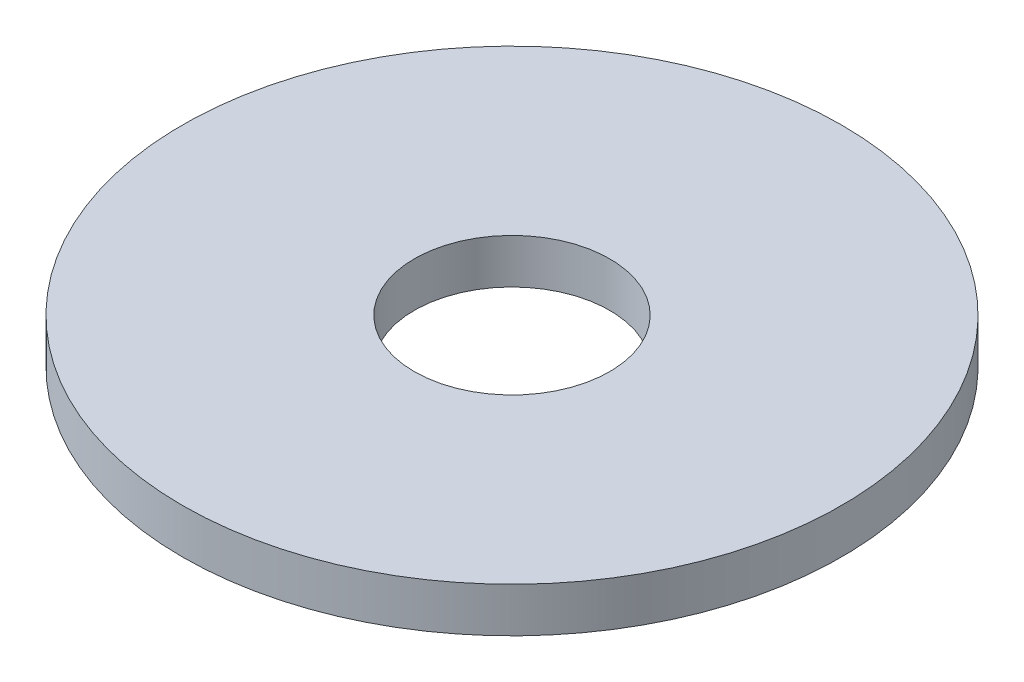
ISO-10303-21;
HEADER;
FILE_DESCRIPTION(('STEP AP214'),'2;1');
FILE_NAME('part.step','',(''),(''),'','','');
FILE_SCHEMA(('AUTOMOTIVE_DESIGN { 1 0 10303 214 1 1 1 1 }'));
ENDSEC;
DATA;
#1=APPLICATION_CONTEXT('core data for automotive mechanical design processes');
#2=APPLICATION_PROTOCOL_DEFINITION('international standard','automotive_design',2000,#1);
#3=PRODUCT_CONTEXT('',#1,'mechanical');
#4=PRODUCT('Part','Part','',(#3));
#5=PRODUCT_RELATED_PRODUCT_CATEGORY('part','',(#4));
#6=PRODUCT_DEFINITION_FORMATION('','',#4);
#7=PRODUCT_DEFINITION_CONTEXT('part definition',#1,'design');
#8=PRODUCT_DEFINITION('design','',#6,#7);
#9=PRODUCT_DEFINITION_SHAPE('','',#8);
#10=(LENGTH_UNIT() NAMED_UNIT(*) SI_UNIT(.MILLI.,.METRE.));
#11=(NAMED_UNIT(*) PLANE_ANGLE_UNIT() SI_UNIT($,.RADIAN.));
#12=(NAMED_UNIT(*) SI_UNIT($,.STERADIAN.) SOLID_ANGLE_UNIT());
#13=UNCERTAINTY_MEASURE_WITH_UNIT(LENGTH_MEASURE(1.E-05),#10,'distance_accuracy_value','');
#14=(GEOMETRIC_REPRESENTATION_CONTEXT(3) GLOBAL_UNCERTAINTY_ASSIGNED_CONTEXT((#13)) GLOBAL_UNIT_ASSIGNED_CONTEXT((#10,
#11,#12)) REPRESENTATION_CONTEXT('',''));
#15=CARTESIAN_POINT('',(0.,0.,0.));
#16=DIRECTION('',(0.,0.,1.));
#17=DIRECTION('',(1.,0.,0.));
#18=AXIS2_PLACEMENT_3D('',#15,#16,#17);
#19=CARTESIAN_POINT('',(0.,0.8,0.));
#20=DIRECTION('',(0.,1.,0.));
#21=DIRECTION('',(0.,0.,1.));
#22=AXIS2_PLACEMENT_3D('',#19,#20,#21);
#23=PLANE('',#22);
#24=CARTESIAN_POINT('',(0.,0.8,0.));
#25=DIRECTION('',(0.,1.,0.));
#26=DIRECTION('',(0.,0.,1.));
#27=AXIS2_PLACEMENT_3D('',#24,#25,#26);
#28=CIRCLE('',#27,5.9);
#29=CARTESIAN_POINT('',(0.,0.8,5.9));
#30=VERTEX_POINT('',#29);
#31=EDGE_CURVE('E10',#30,#30,#28,.T.);
#32=ORIENTED_EDGE('',*,*,#31,.T.);
#33=EDGE_LOOP('',(#32));
#34=FACE_BOUND('',#33,.T.);
#35=CARTESIAN_POINT('',(0.,0.8,0.));
#36=DIRECTION('',(0.,1.,0.));
#37=DIRECTION('',(0.,0.,1.));
#38=AXIS2_PLACEMENT_3D('',#35,#36,#37);
#39=CIRCLE('',#38,1.75);
#40=CARTESIAN_POINT('',(0.,0.8,1.75));
#41=VERTEX_POINT('',#40);
#42=EDGE_CURVE('E54',#41,#41,#39,.T.);
#43=ORIENTED_EDGE('',*,*,#42,.F.);
#44=EDGE_LOOP('',(#43));
#45=FACE_BOUND('',#44,.T.);
#46=ADVANCED_FACE('F41',(#34,#45),#23,.T.);
#47=CARTESIAN_POINT('',(0.,0.,0.));
#48=DIRECTION('',(0.,1.,0.));
#49=DIRECTION('',(0.,0.,1.));
#50=AXIS2_PLACEMENT_3D('',#47,#48,#49);
#51=PLANE('',#50);
#52=CARTESIAN_POINT('',(0.,0.,0.));
#53=DIRECTION('',(0.,1.,0.));
#54=DIRECTION('',(0.,0.,1.));
#55=AXIS2_PLACEMENT_3D('',#52,#53,#54);
#56=CIRCLE('',#55,5.9);
#57=CARTESIAN_POINT('',(0.,0.,5.9));
#58=VERTEX_POINT('',#57);
#59=EDGE_CURVE('E45',#58,#58,#56,.T.);
#60=ORIENTED_EDGE('',*,*,#59,.F.);
#61=EDGE_LOOP('',(#60));
#62=FACE_BOUND('',#61,.T.);
#63=CARTESIAN_POINT('',(0.,0.,0.));
#64=DIRECTION('',(0.,1.,0.));
#65=DIRECTION('',(0.,0.,1.));
#66=AXIS2_PLACEMENT_3D('',#63,#64,#65);
#67=CIRCLE('',#66,1.75);
#68=CARTESIAN_POINT('',(0.,0.,1.75));
#69=VERTEX_POINT('',#68);
#70=EDGE_CURVE('E56',#69,#69,#67,.T.);
#71=ORIENTED_EDGE('',*,*,#70,.T.);
#72=EDGE_LOOP('',(#71));
#73=FACE_BOUND('',#72,.T.);
#74=ADVANCED_FACE('F68',(#62,#73),#51,.F.);
#75=CARTESIAN_POINT('',(0.,0.8,0.));
#76=DIRECTION('',(0.,-1.,0.));
#77=DIRECTION('',(0.,0.,-1.));
#78=AXIS2_PLACEMENT_3D('',#75,#76,#77);
#79=CYLINDRICAL_SURFACE('',#78,5.9);
#80=ORIENTED_EDGE('',*,*,#31,.F.);
#81=EDGE_LOOP('',(#80));
#82=FACE_BOUND('',#81,.T.);
#83=ORIENTED_EDGE('',*,*,#59,.T.);
#84=EDGE_LOOP('',(#83));
#85=FACE_BOUND('',#84,.T.);
#86=ADVANCED_FACE('F43',(#82,#85),#79,.T.);
#87=CARTESIAN_POINT('',(0.,0.8,0.));
#88=DIRECTION('',(0.,-1.,0.));
#89=DIRECTION('',(0.,0.,-1.));
#90=AXIS2_PLACEMENT_3D('',#87,#88,#89);
#91=CYLINDRICAL_SURFACE('',#90,1.75);
#92=ORIENTED_EDGE('',*,*,#42,.T.);
#93=EDGE_LOOP('',(#92));
#94=FACE_BOUND('',#93,.T.);
#95=ORIENTED_EDGE('',*,*,#70,.F.);
#96=EDGE_LOOP('',(#95));
#97=FACE_BOUND('',#96,.T.);
#98=ADVANCED_FACE('F64',(#94,#97),#91,.F.);
#99=CLOSED_SHELL('',(#46,#74,#86,#98));
#100=MANIFOLD_SOLID_BREP('B2',#99);
#101=ADVANCED_BREP_SHAPE_REPRESENTATION('',(#18,#100),#14);
#102=SHAPE_DEFINITION_REPRESENTATION(#9,#101);
ENDSEC;
END-ISO-10303-21;
